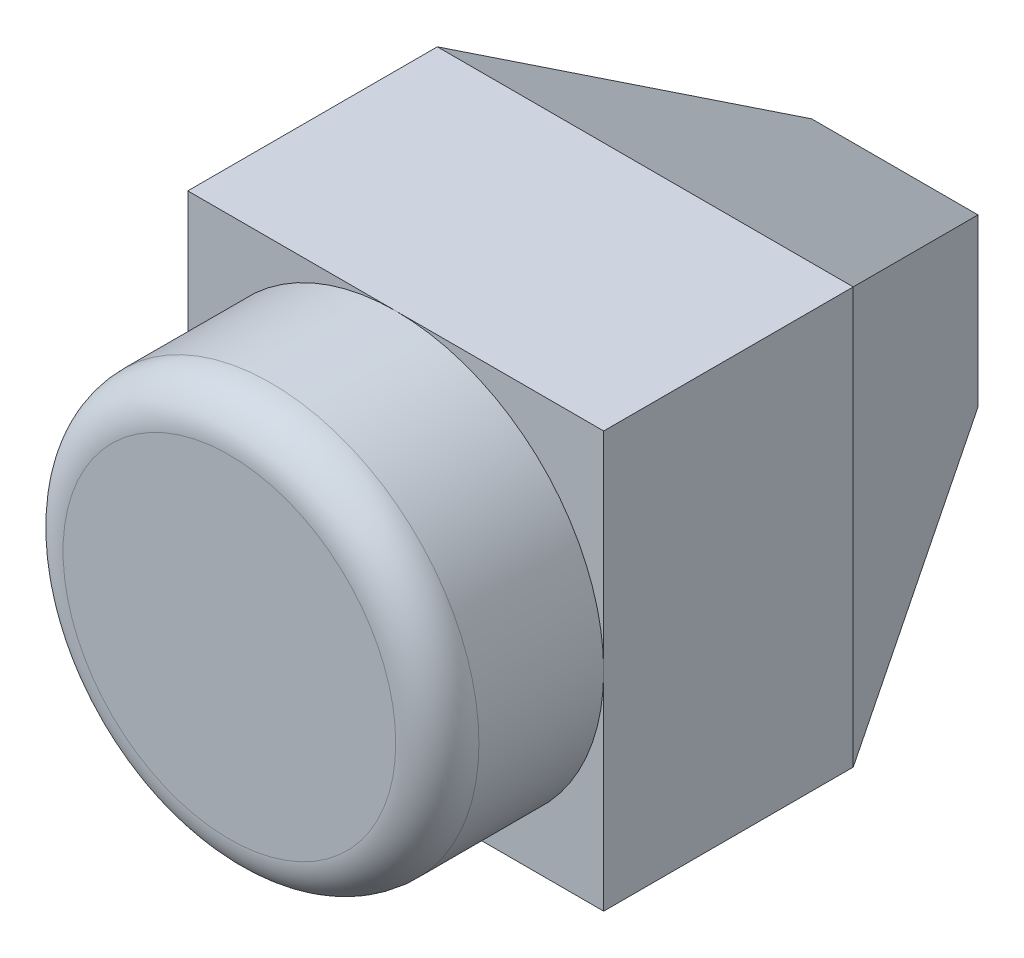
ISO-10303-21;
HEADER;
FILE_DESCRIPTION(('STEP AP214'),'2;1');
FILE_NAME('part.step','',(''),(''),'','','');
FILE_SCHEMA(('AUTOMOTIVE_DESIGN { 1 0 10303 214 1 1 1 1 }'));
ENDSEC;
DATA;
#1=APPLICATION_CONTEXT('core data for automotive mechanical design processes');
#2=APPLICATION_PROTOCOL_DEFINITION('international standard','automotive_design',2000,#1);
#3=PRODUCT_CONTEXT('',#1,'mechanical');
#4=PRODUCT('Part','Part','',(#3));
#5=PRODUCT_RELATED_PRODUCT_CATEGORY('part','',(#4));
#6=PRODUCT_DEFINITION_FORMATION('','',#4);
#7=PRODUCT_DEFINITION_CONTEXT('part definition',#1,'design');
#8=PRODUCT_DEFINITION('design','',#6,#7);
#9=PRODUCT_DEFINITION_SHAPE('','',#8);
#10=(LENGTH_UNIT() NAMED_UNIT(*) SI_UNIT(.MILLI.,.METRE.));
#11=(NAMED_UNIT(*) PLANE_ANGLE_UNIT() SI_UNIT($,.RADIAN.));
#12=(NAMED_UNIT(*) SI_UNIT($,.STERADIAN.) SOLID_ANGLE_UNIT());
#13=UNCERTAINTY_MEASURE_WITH_UNIT(LENGTH_MEASURE(1.E-05),#10,'distance_accuracy_value','');
#14=(GEOMETRIC_REPRESENTATION_CONTEXT(3) GLOBAL_UNCERTAINTY_ASSIGNED_CONTEXT((#13)) GLOBAL_UNIT_ASSIGNED_CONTEXT((#10,
#11,#12)) REPRESENTATION_CONTEXT('',''));
#15=CARTESIAN_POINT('',(0.,0.,0.));
#16=DIRECTION('',(0.,0.,1.));
#17=DIRECTION('',(1.,0.,0.));
#18=AXIS2_PLACEMENT_3D('',#15,#16,#17);
#19=CARTESIAN_POINT('',(0.,0.,4.));
#20=DIRECTION('',(0.,0.,-1.));
#21=DIRECTION('',(-1.,0.,0.));
#22=AXIS2_PLACEMENT_3D('',#19,#20,#21);
#23=CYLINDRICAL_SURFACE('',#22,5.);
#24=CARTESIAN_POINT('',(0.,0.,3.));
#25=DIRECTION('',(0.,0.,1.));
#26=DIRECTION('',(1.,0.,0.));
#27=AXIS2_PLACEMENT_3D('',#24,#25,#26);
#28=CIRCLE('',#27,5.);
#29=CARTESIAN_POINT('',(5.,0.,3.));
#30=VERTEX_POINT('',#29);
#31=EDGE_CURVE('E151',#30,#30,#28,.F.);
#32=ORIENTED_EDGE('',*,*,#31,.T.);
#33=EDGE_LOOP('',(#32));
#34=FACE_BOUND('',#33,.T.);
#35=CARTESIAN_POINT('',(0.,0.,0.));
#36=DIRECTION('',(0.,0.,1.));
#37=DIRECTION('',(1.,0.,0.));
#38=AXIS2_PLACEMENT_3D('',#35,#36,#37);
#39=CIRCLE('',#38,5.);
#40=CARTESIAN_POINT('',(5.,0.,0.));
#41=VERTEX_POINT('',#40);
#42=CARTESIAN_POINT('',(0.,5.,0.));
#43=VERTEX_POINT('',#42);
#44=EDGE_CURVE('E146',#41,#43,#39,.T.);
#45=ORIENTED_EDGE('',*,*,#44,.T.);
#46=CARTESIAN_POINT('',(-5.,0.,0.));
#47=VERTEX_POINT('',#46);
#48=EDGE_CURVE('E128',#43,#47,#39,.T.);
#49=ORIENTED_EDGE('',*,*,#48,.T.);
#50=CARTESIAN_POINT('',(0.,-5.,0.));
#51=VERTEX_POINT('',#50);
#52=EDGE_CURVE('E378',#47,#51,#39,.T.);
#53=ORIENTED_EDGE('',*,*,#52,.T.);
#54=EDGE_CURVE('E115',#51,#41,#39,.T.);
#55=ORIENTED_EDGE('',*,*,#54,.T.);
#56=EDGE_LOOP('',(#45,#49,#53,#55));
#57=FACE_BOUND('',#56,.T.);
#58=ADVANCED_FACE('F41',(#34,#57),#23,.T.);
#59=CARTESIAN_POINT('',(0.,0.,4.));
#60=DIRECTION('',(0.,0.,1.));
#61=DIRECTION('',(1.,0.,0.));
#62=AXIS2_PLACEMENT_3D('',#59,#60,#61);
#63=PLANE('',#62);
#64=CARTESIAN_POINT('',(0.,0.,4.));
#65=DIRECTION('',(0.,0.,1.));
#66=DIRECTION('',(1.,0.,0.));
#67=AXIS2_PLACEMENT_3D('',#64,#65,#66);
#68=CIRCLE('',#67,4.);
#69=CARTESIAN_POINT('',(4.,0.,4.));
#70=VERTEX_POINT('',#69);
#71=EDGE_CURVE('E148',#70,#70,#68,.T.);
#72=ORIENTED_EDGE('',*,*,#71,.T.);
#73=EDGE_LOOP('',(#72));
#74=FACE_BOUND('',#73,.T.);
#75=ADVANCED_FACE('F210',(#74),#63,.T.);
#76=CARTESIAN_POINT('',(0.,0.,0.));
#77=DIRECTION('',(0.,0.,1.));
#78=DIRECTION('',(1.,0.,0.));
#79=AXIS2_PLACEMENT_3D('',#76,#77,#78);
#80=PLANE('',#79);
#81=ORIENTED_EDGE('',*,*,#44,.F.);
#82=DIRECTION('',(0.,-1.,0.));
#83=VECTOR('',#82,1.);
#84=CARTESIAN_POINT('',(5.,-5.,0.));
#85=LINE('',#84,#83);
#86=CARTESIAN_POINT('',(5.,5.,0.));
#87=VERTEX_POINT('',#86);
#88=EDGE_CURVE('E134',#87,#41,#85,.T.);
#89=ORIENTED_EDGE('',*,*,#88,.F.);
#90=DIRECTION('',(1.,0.,0.));
#91=VECTOR('',#90,1.);
#92=CARTESIAN_POINT('',(5.,5.,0.));
#93=LINE('',#92,#91);
#94=EDGE_CURVE('E131',#43,#87,#93,.T.);
#95=ORIENTED_EDGE('',*,*,#94,.F.);
#96=EDGE_LOOP('',(#81,#89,#95));
#97=FACE_BOUND('',#96,.T.);
#98=ADVANCED_FACE('F216',(#97),#80,.T.);
#99=ORIENTED_EDGE('',*,*,#48,.F.);
#100=CARTESIAN_POINT('',(-5.,5.,0.));
#101=VERTEX_POINT('',#100);
#102=EDGE_CURVE('E111',#101,#43,#93,.T.);
#103=ORIENTED_EDGE('',*,*,#102,.F.);
#104=DIRECTION('',(0.,1.,0.));
#105=VECTOR('',#104,1.);
#106=CARTESIAN_POINT('',(-5.,-5.,0.));
#107=LINE('',#106,#105);
#108=EDGE_CURVE('E120',#47,#101,#107,.T.);
#109=ORIENTED_EDGE('',*,*,#108,.F.);
#110=EDGE_LOOP('',(#99,#103,#109));
#111=FACE_BOUND('',#110,.T.);
#112=ADVANCED_FACE('F127',(#111),#80,.T.);
#113=ORIENTED_EDGE('',*,*,#52,.F.);
#114=CARTESIAN_POINT('',(-5.,-5.,0.));
#115=VERTEX_POINT('',#114);
#116=EDGE_CURVE('E123',#115,#47,#107,.T.);
#117=ORIENTED_EDGE('',*,*,#116,.F.);
#118=DIRECTION('',(-1.,0.,0.));
#119=VECTOR('',#118,1.);
#120=CARTESIAN_POINT('',(5.,-5.,0.));
#121=LINE('',#120,#119);
#122=EDGE_CURVE('E137',#51,#115,#121,.T.);
#123=ORIENTED_EDGE('',*,*,#122,.F.);
#124=EDGE_LOOP('',(#113,#117,#123));
#125=FACE_BOUND('',#124,.T.);
#126=ADVANCED_FACE('F328',(#125),#80,.T.);
#127=ORIENTED_EDGE('',*,*,#54,.F.);
#128=CARTESIAN_POINT('',(5.,-5.,0.));
#129=VERTEX_POINT('',#128);
#130=EDGE_CURVE('E138',#129,#51,#121,.T.);
#131=ORIENTED_EDGE('',*,*,#130,.F.);
#132=EDGE_CURVE('E130',#41,#129,#85,.T.);
#133=ORIENTED_EDGE('',*,*,#132,.F.);
#134=EDGE_LOOP('',(#127,#131,#133));
#135=FACE_BOUND('',#134,.T.);
#136=ADVANCED_FACE('F258',(#135),#80,.T.);
#137=CARTESIAN_POINT('',(-5.,-5.,-12.));
#138=DIRECTION('',(1.,0.,0.));
#139=DIRECTION('',(0.,1.,0.));
#140=AXIS2_PLACEMENT_3D('',#137,#138,#139);
#141=PLANE('',#140);
#142=DIRECTION('',(0.,0.,1.));
#143=VECTOR('',#142,1.);
#144=CARTESIAN_POINT('',(-5.,5.,-12.));
#145=LINE('',#144,#143);
#146=CARTESIAN_POINT('',(-5.,5.,-5.99999999999996));
#147=VERTEX_POINT('',#146);
#148=EDGE_CURVE('E106',#147,#101,#145,.T.);
#149=ORIENTED_EDGE('',*,*,#148,.F.);
#150=DIRECTION('',(0.,-1.,0.));
#151=VECTOR('',#150,1.);
#152=CARTESIAN_POINT('',(-5.,-5.,-5.99999999999996));
#153=LINE('',#152,#151);
#154=CARTESIAN_POINT('',(-5.,-5.,-5.99999999999996));
#155=VERTEX_POINT('',#154);
#156=EDGE_CURVE('E11',#147,#155,#153,.T.);
#157=ORIENTED_EDGE('',*,*,#156,.T.);
#158=DIRECTION('',(0.,0.,1.));
#159=VECTOR('',#158,1.);
#160=CARTESIAN_POINT('',(-5.,-5.,-12.));
#161=LINE('',#160,#159);
#162=EDGE_CURVE('E141',#155,#115,#161,.T.);
#163=ORIENTED_EDGE('',*,*,#162,.T.);
#164=ORIENTED_EDGE('',*,*,#116,.T.);
#165=ORIENTED_EDGE('',*,*,#108,.T.);
#166=EDGE_LOOP('',(#149,#157,#163,#164,#165));
#167=FACE_BOUND('',#166,.T.);
#168=ADVANCED_FACE('F121',(#167),#141,.F.);
#169=CARTESIAN_POINT('',(5.,5.,-12.));
#170=DIRECTION('',(0.,-1.,0.));
#171=DIRECTION('',(1.,0.,0.));
#172=AXIS2_PLACEMENT_3D('',#169,#170,#171);
#173=PLANE('',#172);
#174=DIRECTION('',(0.,0.,1.));
#175=VECTOR('',#174,1.);
#176=CARTESIAN_POINT('',(5.,5.,-12.));
#177=LINE('',#176,#175);
#178=CARTESIAN_POINT('',(5.,5.,-5.99999999999996));
#179=VERTEX_POINT('',#178);
#180=EDGE_CURVE('E116',#179,#87,#177,.T.);
#181=ORIENTED_EDGE('',*,*,#180,.F.);
#182=DIRECTION('',(-1.,0.,0.));
#183=VECTOR('',#182,1.);
#184=CARTESIAN_POINT('',(5.,5.,-5.99999999999996));
#185=LINE('',#184,#183);
#186=EDGE_CURVE('E51',#179,#147,#185,.T.);
#187=ORIENTED_EDGE('',*,*,#186,.T.);
#188=ORIENTED_EDGE('',*,*,#148,.T.);
#189=ORIENTED_EDGE('',*,*,#102,.T.);
#190=ORIENTED_EDGE('',*,*,#94,.T.);
#191=EDGE_LOOP('',(#181,#187,#188,#189,#190));
#192=FACE_BOUND('',#191,.T.);
#193=ADVANCED_FACE('F108',(#192),#173,.F.);
#194=CARTESIAN_POINT('',(5.,-5.,-12.));
#195=DIRECTION('',(-1.,0.,0.));
#196=DIRECTION('',(0.,-1.,0.));
#197=AXIS2_PLACEMENT_3D('',#194,#195,#196);
#198=PLANE('',#197);
#199=DIRECTION('',(0.,0.,1.));
#200=VECTOR('',#199,1.);
#201=CARTESIAN_POINT('',(5.,-5.,-12.));
#202=LINE('',#201,#200);
#203=CARTESIAN_POINT('',(5.,-5.,-5.99999999999996));
#204=VERTEX_POINT('',#203);
#205=EDGE_CURVE('E143',#204,#129,#202,.T.);
#206=ORIENTED_EDGE('',*,*,#205,.F.);
#207=DIRECTION('',(0.,1.,0.));
#208=VECTOR('',#207,1.);
#209=CARTESIAN_POINT('',(5.,-5.,-5.99999999999996));
#210=LINE('',#209,#208);
#211=EDGE_CURVE('E66',#204,#179,#210,.T.);
#212=ORIENTED_EDGE('',*,*,#211,.T.);
#213=ORIENTED_EDGE('',*,*,#180,.T.);
#214=ORIENTED_EDGE('',*,*,#88,.T.);
#215=ORIENTED_EDGE('',*,*,#132,.T.);
#216=EDGE_LOOP('',(#206,#212,#213,#214,#215));
#217=FACE_BOUND('',#216,.T.);
#218=ADVANCED_FACE('F206',(#217),#198,.F.);
#219=CARTESIAN_POINT('',(5.,-5.,-12.));
#220=DIRECTION('',(0.,1.,0.));
#221=DIRECTION('',(-1.,0.,0.));
#222=AXIS2_PLACEMENT_3D('',#219,#220,#221);
#223=PLANE('',#222);
#224=ORIENTED_EDGE('',*,*,#162,.F.);
#225=DIRECTION('',(1.,0.,0.));
#226=VECTOR('',#225,1.);
#227=CARTESIAN_POINT('',(5.,-5.,-5.99999999999996));
#228=LINE('',#227,#226);
#229=EDGE_CURVE('E163',#155,#204,#228,.T.);
#230=ORIENTED_EDGE('',*,*,#229,.T.);
#231=ORIENTED_EDGE('',*,*,#205,.T.);
#232=ORIENTED_EDGE('',*,*,#130,.T.);
#233=ORIENTED_EDGE('',*,*,#122,.T.);
#234=EDGE_LOOP('',(#224,#230,#231,#232,#233));
#235=FACE_BOUND('',#234,.T.);
#236=ADVANCED_FACE('F190',(#235),#223,.F.);
#237=CARTESIAN_POINT('',(0.,0.,-12.));
#238=DIRECTION('',(0.,0.,1.));
#239=DIRECTION('',(1.,0.,0.));
#240=AXIS2_PLACEMENT_3D('',#237,#238,#239);
#241=PLANE('',#240);
#242=DIRECTION('',(0.,-1.,0.));
#243=VECTOR('',#242,1.);
#244=CARTESIAN_POINT('',(2.,0.,-12.));
#245=LINE('',#244,#243);
#246=CARTESIAN_POINT('',(2.,2.,-12.));
#247=VERTEX_POINT('',#246);
#248=CARTESIAN_POINT('',(2.,-2.,-12.));
#249=VERTEX_POINT('',#248);
#250=EDGE_CURVE('E158',#247,#249,#245,.T.);
#251=ORIENTED_EDGE('',*,*,#250,.T.);
#252=DIRECTION('',(-1.,0.,0.));
#253=VECTOR('',#252,1.);
#254=CARTESIAN_POINT('',(0.,-2.,-12.));
#255=LINE('',#254,#253);
#256=CARTESIAN_POINT('',(-2.,-2.,-12.));
#257=VERTEX_POINT('',#256);
#258=EDGE_CURVE('E160',#249,#257,#255,.T.);
#259=ORIENTED_EDGE('',*,*,#258,.T.);
#260=DIRECTION('',(0.,1.,0.));
#261=VECTOR('',#260,1.);
#262=CARTESIAN_POINT('',(-2.,0.,-12.));
#263=LINE('',#262,#261);
#264=CARTESIAN_POINT('',(-2.,2.,-12.));
#265=VERTEX_POINT('',#264);
#266=EDGE_CURVE('E154',#257,#265,#263,.T.);
#267=ORIENTED_EDGE('',*,*,#266,.T.);
#268=DIRECTION('',(1.,0.,0.));
#269=VECTOR('',#268,1.);
#270=CARTESIAN_POINT('',(0.,2.,-12.));
#271=LINE('',#270,#269);
#272=EDGE_CURVE('E156',#265,#247,#271,.T.);
#273=ORIENTED_EDGE('',*,*,#272,.T.);
#274=EDGE_LOOP('',(#251,#259,#267,#273));
#275=FACE_BOUND('',#274,.T.);
#276=ADVANCED_FACE('F196',(#275),#241,.F.);
#277=CARTESIAN_POINT('',(0.,0.,3.));
#278=DIRECTION('',(0.,0.,1.));
#279=DIRECTION('',(1.,0.,0.));
#280=AXIS2_PLACEMENT_3D('',#277,#278,#279);
#281=TOROIDAL_SURFACE('',#280,4.,1.);
#282=ORIENTED_EDGE('',*,*,#31,.F.);
#283=EDGE_LOOP('',(#282));
#284=FACE_BOUND('',#283,.T.);
#285=ORIENTED_EDGE('',*,*,#71,.F.);
#286=EDGE_LOOP('',(#285));
#287=FACE_BOUND('',#286,.T.);
#288=ADVANCED_FACE('F198',(#284,#287),#281,.T.);
#289=CARTESIAN_POINT('',(0.,2.,-12.));
#290=DIRECTION('',(0.,-0.894427190999917,0.447213595499956));
#291=DIRECTION('',(1.,0.,0.));
#292=AXIS2_PLACEMENT_3D('',#289,#290,#291);
#293=PLANE('',#292);
#294=DIRECTION('',(0.408248290463861,-0.408248290463862,-0.816496580927728));
#295=VECTOR('',#294,1.);
#296=CARTESIAN_POINT('',(-1.66666666666667,1.66666666666667,-12.6666666666667));
#297=LINE('',#296,#295);
#298=EDGE_CURVE('E171',#147,#265,#297,.T.);
#299=ORIENTED_EDGE('',*,*,#298,.F.);
#300=ORIENTED_EDGE('',*,*,#186,.F.);
#301=DIRECTION('',(-0.408248290463862,-0.408248290463861,-0.816496580927728));
#302=VECTOR('',#301,1.);
#303=CARTESIAN_POINT('',(1.66666666666667,1.66666666666667,-12.6666666666667));
#304=LINE('',#303,#302);
#305=EDGE_CURVE('E46',#247,#179,#304,.F.);
#306=ORIENTED_EDGE('',*,*,#305,.F.);
#307=ORIENTED_EDGE('',*,*,#272,.F.);
#308=EDGE_LOOP('',(#299,#300,#306,#307));
#309=FACE_BOUND('',#308,.T.);
#310=ADVANCED_FACE('F44',(#309),#293,.F.);
#311=CARTESIAN_POINT('',(2.,0.,-12.));
#312=DIRECTION('',(-0.894427190999917,0.,0.447213595499956));
#313=DIRECTION('',(0.,-1.,0.));
#314=AXIS2_PLACEMENT_3D('',#311,#312,#313);
#315=PLANE('',#314);
#316=ORIENTED_EDGE('',*,*,#305,.T.);
#317=ORIENTED_EDGE('',*,*,#211,.F.);
#318=DIRECTION('',(-0.408248290463861,0.408248290463862,-0.816496580927728));
#319=VECTOR('',#318,1.);
#320=CARTESIAN_POINT('',(1.66666666666667,-1.66666666666667,-12.6666666666667));
#321=LINE('',#320,#319);
#322=EDGE_CURVE('E170',#249,#204,#321,.F.);
#323=ORIENTED_EDGE('',*,*,#322,.F.);
#324=ORIENTED_EDGE('',*,*,#250,.F.);
#325=EDGE_LOOP('',(#316,#317,#323,#324));
#326=FACE_BOUND('',#325,.T.);
#327=ADVANCED_FACE('F180',(#326),#315,.F.);
#328=CARTESIAN_POINT('',(-2.,0.,-12.));
#329=DIRECTION('',(0.894427190999917,0.,0.447213595499956));
#330=DIRECTION('',(0.,1.,0.));
#331=AXIS2_PLACEMENT_3D('',#328,#329,#330);
#332=PLANE('',#331);
#333=ORIENTED_EDGE('',*,*,#298,.T.);
#334=ORIENTED_EDGE('',*,*,#266,.F.);
#335=DIRECTION('',(-0.408248290463862,-0.408248290463861,0.816496580927728));
#336=VECTOR('',#335,1.);
#337=CARTESIAN_POINT('',(-1.66666666666667,-1.66666666666666,-12.6666666666667));
#338=LINE('',#337,#336);
#339=EDGE_CURVE('E168',#155,#257,#338,.F.);
#340=ORIENTED_EDGE('',*,*,#339,.F.);
#341=ORIENTED_EDGE('',*,*,#156,.F.);
#342=EDGE_LOOP('',(#333,#334,#340,#341));
#343=FACE_BOUND('',#342,.T.);
#344=ADVANCED_FACE('F185',(#343),#332,.F.);
#345=CARTESIAN_POINT('',(0.,-2.,-12.));
#346=DIRECTION('',(0.,0.894427190999917,0.447213595499956));
#347=DIRECTION('',(-1.,0.,0.));
#348=AXIS2_PLACEMENT_3D('',#345,#346,#347);
#349=PLANE('',#348);
#350=ORIENTED_EDGE('',*,*,#322,.T.);
#351=ORIENTED_EDGE('',*,*,#229,.F.);
#352=ORIENTED_EDGE('',*,*,#339,.T.);
#353=ORIENTED_EDGE('',*,*,#258,.F.);
#354=EDGE_LOOP('',(#350,#351,#352,#353));
#355=FACE_BOUND('',#354,.T.);
#356=ADVANCED_FACE('F193',(#355),#349,.F.);
#357=CLOSED_SHELL('',(#58,#75,#98,#112,#126,#136,#168,#193,#218,#236,#276,#288,#310,#327,#344,#356));
#358=MANIFOLD_SOLID_BREP('B2',#357);
#359=ADVANCED_BREP_SHAPE_REPRESENTATION('',(#18,#358),#14);
#360=SHAPE_DEFINITION_REPRESENTATION(#9,#359);
ENDSEC;
END-ISO-10303-21;
